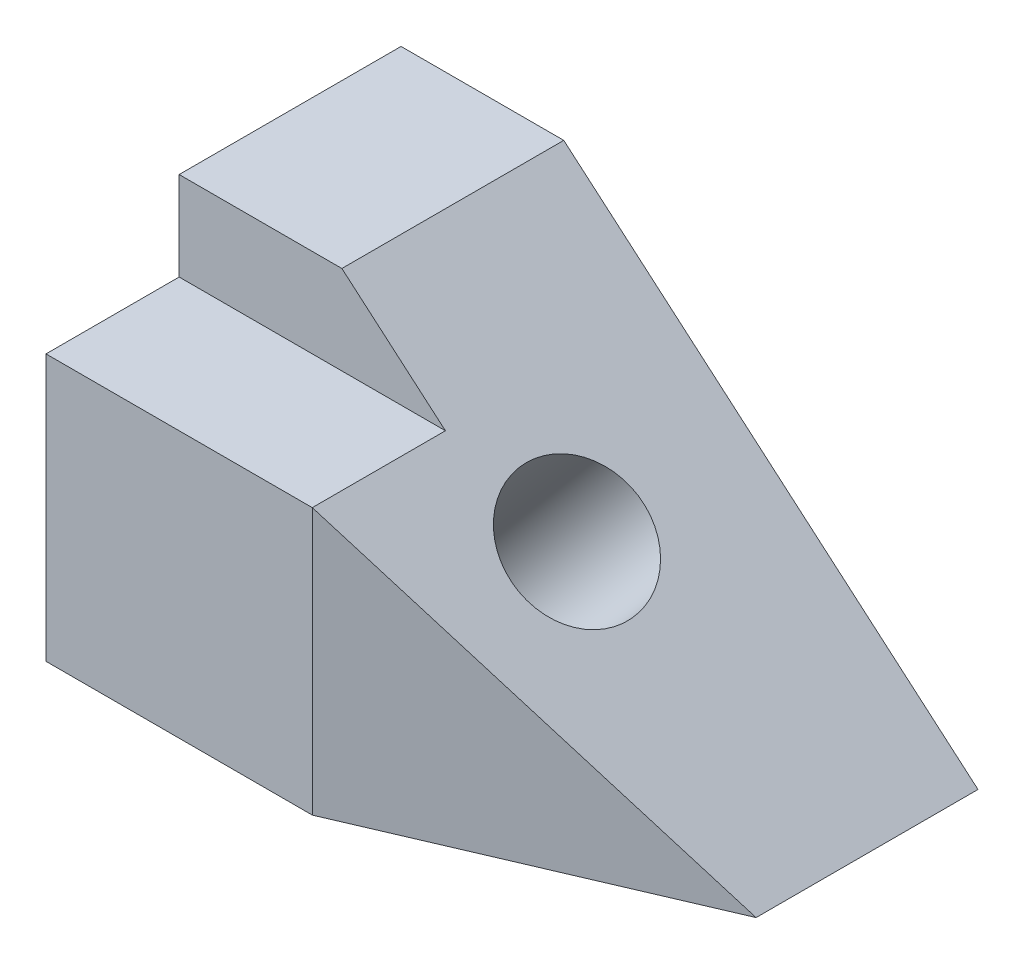
ISO-10303-21;
HEADER;
FILE_DESCRIPTION(('STEP AP214'),'2;1');
FILE_NAME('part.step','',(''),(''),'','','');
FILE_SCHEMA(('AUTOMOTIVE_DESIGN { 1 0 10303 214 1 1 1 1 }'));
ENDSEC;
DATA;
#1=APPLICATION_CONTEXT('core data for automotive mechanical design processes');
#2=APPLICATION_PROTOCOL_DEFINITION('international standard','automotive_design',2000,#1);
#3=PRODUCT_CONTEXT('',#1,'mechanical');
#4=PRODUCT('Part','Part','',(#3));
#5=PRODUCT_RELATED_PRODUCT_CATEGORY('part','',(#4));
#6=PRODUCT_DEFINITION_FORMATION('','',#4);
#7=PRODUCT_DEFINITION_CONTEXT('part definition',#1,'design');
#8=PRODUCT_DEFINITION('design','',#6,#7);
#9=PRODUCT_DEFINITION_SHAPE('','',#8);
#10=(LENGTH_UNIT() NAMED_UNIT(*) SI_UNIT(.MILLI.,.METRE.));
#11=(NAMED_UNIT(*) PLANE_ANGLE_UNIT() SI_UNIT($,.RADIAN.));
#12=(NAMED_UNIT(*) SI_UNIT($,.STERADIAN.) SOLID_ANGLE_UNIT());
#13=UNCERTAINTY_MEASURE_WITH_UNIT(LENGTH_MEASURE(1.E-05),#10,'distance_accuracy_value','');
#14=(GEOMETRIC_REPRESENTATION_CONTEXT(3) GLOBAL_UNCERTAINTY_ASSIGNED_CONTEXT((#13)) GLOBAL_UNIT_ASSIGNED_CONTEXT((#10,
#11,#12)) REPRESENTATION_CONTEXT('',''));
#15=CARTESIAN_POINT('',(0.,0.,0.));
#16=DIRECTION('',(0.,0.,1.));
#17=DIRECTION('',(1.,0.,0.));
#18=AXIS2_PLACEMENT_3D('',#15,#16,#17);
#19=CARTESIAN_POINT('',(40.618487394958,47.3882352941177,-50.));
#20=DIRECTION('',(0.650791373455968,0.759256602365297,0.));
#21=DIRECTION('',(-0.759256602365297,0.650791373455968,0.));
#22=AXIS2_PLACEMENT_3D('',#19,#20,#21);
#23=PLANE('',#22);
#24=CARTESIAN_POINT('',(15.012018931971,69.3366368338208,-10.));
#25=DIRECTION('',(0.650791373455968,0.759256602365297,0.));
#26=DIRECTION('',(-0.759256602365297,0.650791373455968,0.));
#27=AXIS2_PLACEMENT_3D('',#24,#25,#26);
#28=CIRCLE('',#27,15.);
#29=CARTESIAN_POINT('',(3.62316989649152,79.0985074356603,-10.));
#30=VERTEX_POINT('',#29);
#31=EDGE_CURVE('E109',#30,#30,#28,.T.);
#32=ORIENTED_EDGE('',*,*,#31,.F.);
#33=EDGE_LOOP('',(#32));
#34=FACE_BOUND('',#33,.T.);
#35=DIRECTION('',(0.,0.,-1.));
#36=VECTOR('',#35,1.);
#37=CARTESIAN_POINT('',(-4.62857142857143,86.1714285714286,30.));
#38=LINE('',#37,#36);
#39=CARTESIAN_POINT('',(-4.62857142857143,86.1714285714286,30.));
#40=VERTEX_POINT('',#39);
#41=CARTESIAN_POINT('',(-4.62857142857143,86.1714285714286,0.));
#42=VERTEX_POINT('',#41);
#43=EDGE_CURVE('E52',#40,#42,#38,.T.);
#44=ORIENTED_EDGE('',*,*,#43,.F.);
#45=DIRECTION('',(-0.721994872381156,0.618852747755276,0.309426373877638));
#46=VECTOR('',#45,1.);
#47=CARTESIAN_POINT('',(22.1803860182371,63.1923221884499,18.5104468085106));
#48=LINE('',#47,#46);
#49=CARTESIAN_POINT('',(65.3714285714286,26.1714285714286,0.));
#50=VERTEX_POINT('',#49);
#51=EDGE_CURVE('E105',#50,#40,#48,.T.);
#52=ORIENTED_EDGE('',*,*,#51,.F.);
#53=DIRECTION('',(0.,0.,1.));
#54=VECTOR('',#53,1.);
#55=CARTESIAN_POINT('',(65.3714285714286,26.1714285714286,-50.));
#56=LINE('',#55,#54);
#57=CARTESIAN_POINT('',(65.3714285714286,26.1714285714286,-50.));
#58=VERTEX_POINT('',#57);
#59=EDGE_CURVE('E114',#58,#50,#56,.T.);
#60=ORIENTED_EDGE('',*,*,#59,.F.);
#61=DIRECTION('',(-0.759256602365297,0.650791373455968,0.));
#62=VECTOR('',#61,1.);
#63=CARTESIAN_POINT('',(40.618487394958,47.3882352941177,-50.));
#64=LINE('',#63,#62);
#65=CARTESIAN_POINT('',(-27.9619047619048,106.171428571429,-50.));
#66=VERTEX_POINT('',#65);
#67=EDGE_CURVE('E137',#58,#66,#64,.T.);
#68=ORIENTED_EDGE('',*,*,#67,.T.);
#69=DIRECTION('',(0.,0.,1.));
#70=VECTOR('',#69,1.);
#71=CARTESIAN_POINT('',(-27.9619047619048,106.171428571429,-50.));
#72=LINE('',#71,#70);
#73=CARTESIAN_POINT('',(-27.9619047619048,106.171428571429,0.));
#74=VERTEX_POINT('',#73);
#75=EDGE_CURVE('E44',#66,#74,#72,.T.);
#76=ORIENTED_EDGE('',*,*,#75,.T.);
#77=DIRECTION('',(-0.759256602365297,0.650791373455968,0.));
#78=VECTOR('',#77,1.);
#79=CARTESIAN_POINT('',(40.618487394958,47.3882352941177,0.));
#80=LINE('',#79,#78);
#81=EDGE_CURVE('E144',#42,#74,#80,.T.);
#82=ORIENTED_EDGE('',*,*,#81,.F.);
#83=EDGE_LOOP('',(#44,#52,#60,#68,#76,#82));
#84=FACE_BOUND('',#83,.T.);
#85=ADVANCED_FACE('F35',(#34,#84),#23,.T.);
#86=CARTESIAN_POINT('',(0.,26.1714285714286,-50.));
#87=DIRECTION('',(0.,-1.,0.));
#88=DIRECTION('',(0.,0.,-1.));
#89=AXIS2_PLACEMENT_3D('',#86,#87,#88);
#90=PLANE('',#89);
#91=CARTESIAN_POINT('',(-21.9867310072223,26.1714285714286,-10.));
#92=DIRECTION('',(0.,-1.,0.));
#93=DIRECTION('',(1.,0.,0.));
#94=AXIS2_PLACEMENT_3D('',#91,#92,#93);
#95=ELLIPSE('',#94,19.756166694199,15.);
#96=CARTESIAN_POINT('',(-2.23056431302327,26.1714285714286,-10.));
#97=VERTEX_POINT('',#96);
#98=EDGE_CURVE('E156',#97,#97,#95,.F.);
#99=ORIENTED_EDGE('',*,*,#98,.T.);
#100=EDGE_LOOP('',(#99));
#101=FACE_BOUND('',#100,.T.);
#102=ORIENTED_EDGE('',*,*,#59,.T.);
#103=DIRECTION('',(0.919145030018058,0.,-0.393919298579168));
#104=VECTOR('',#103,1.);
#105=CARTESIAN_POINT('',(-4.62857142857145,26.1714285714286,30.));
#106=LINE('',#105,#104);
#107=CARTESIAN_POINT('',(-4.62857142857144,26.1714285714286,30.));
#108=VERTEX_POINT('',#107);
#109=EDGE_CURVE('E103',#108,#50,#106,.T.);
#110=ORIENTED_EDGE('',*,*,#109,.F.);
#111=DIRECTION('',(1.,0.,0.));
#112=VECTOR('',#111,1.);
#113=CARTESIAN_POINT('',(0.,26.1714285714286,30.));
#114=LINE('',#113,#112);
#115=CARTESIAN_POINT('',(-64.6285714285714,26.1714285714286,30.));
#116=VERTEX_POINT('',#115);
#117=EDGE_CURVE('E113',#116,#108,#114,.T.);
#118=ORIENTED_EDGE('',*,*,#117,.F.);
#119=DIRECTION('',(0.,0.,1.));
#120=VECTOR('',#119,1.);
#121=CARTESIAN_POINT('',(-64.6285714285714,26.1714285714286,-50.));
#122=LINE('',#121,#120);
#123=CARTESIAN_POINT('',(-64.6285714285714,26.1714285714286,-50.));
#124=VERTEX_POINT('',#123);
#125=EDGE_CURVE('E39',#124,#116,#122,.T.);
#126=ORIENTED_EDGE('',*,*,#125,.F.);
#127=DIRECTION('',(1.,0.,0.));
#128=VECTOR('',#127,1.);
#129=CARTESIAN_POINT('',(0.,26.1714285714286,-50.));
#130=LINE('',#129,#128);
#131=EDGE_CURVE('E134',#124,#58,#130,.T.);
#132=ORIENTED_EDGE('',*,*,#131,.T.);
#133=EDGE_LOOP('',(#102,#110,#118,#126,#132));
#134=FACE_BOUND('',#133,.T.);
#135=ADVANCED_FACE('F112',(#101,#134),#90,.T.);
#136=CARTESIAN_POINT('',(0.,0.,30.));
#137=DIRECTION('',(0.,0.,1.));
#138=DIRECTION('',(1.,0.,0.));
#139=AXIS2_PLACEMENT_3D('',#136,#137,#138);
#140=PLANE('',#139);
#141=ORIENTED_EDGE('',*,*,#117,.T.);
#142=DIRECTION('',(0.,1.,0.));
#143=VECTOR('',#142,1.);
#144=CARTESIAN_POINT('',(-4.62857142857145,26.1704285714286,30.));
#145=LINE('',#144,#143);
#146=EDGE_CURVE('E100',#108,#40,#145,.T.);
#147=ORIENTED_EDGE('',*,*,#146,.T.);
#148=DIRECTION('',(1.,0.,0.));
#149=VECTOR('',#148,1.);
#150=CARTESIAN_POINT('',(0.,86.1714285714286,30.));
#151=LINE('',#150,#149);
#152=CARTESIAN_POINT('',(-64.6285714285714,86.1714285714286,30.));
#153=VERTEX_POINT('',#152);
#154=EDGE_CURVE('E120',#153,#40,#151,.T.);
#155=ORIENTED_EDGE('',*,*,#154,.F.);
#156=DIRECTION('',(0.,-1.,0.));
#157=VECTOR('',#156,1.);
#158=CARTESIAN_POINT('',(-64.6285714285714,0.,30.));
#159=LINE('',#158,#157);
#160=EDGE_CURVE('E119',#153,#116,#159,.T.);
#161=ORIENTED_EDGE('',*,*,#160,.T.);
#162=EDGE_LOOP('',(#141,#147,#155,#161));
#163=FACE_BOUND('',#162,.T.);
#164=ADVANCED_FACE('F117',(#163),#140,.T.);
#165=CARTESIAN_POINT('',(0.,0.,0.));
#166=DIRECTION('',(0.,0.,1.));
#167=DIRECTION('',(1.,0.,0.));
#168=AXIS2_PLACEMENT_3D('',#165,#166,#167);
#169=PLANE('',#168);
#170=DIRECTION('',(0.,-1.,0.));
#171=VECTOR('',#170,1.);
#172=CARTESIAN_POINT('',(-64.6285714285714,0.,0.));
#173=LINE('',#172,#171);
#174=CARTESIAN_POINT('',(-64.6285714285714,106.171428571429,0.));
#175=VERTEX_POINT('',#174);
#176=CARTESIAN_POINT('',(-64.6285714285714,86.1714285714286,0.));
#177=VERTEX_POINT('',#176);
#178=EDGE_CURVE('E131',#175,#177,#173,.T.);
#179=ORIENTED_EDGE('',*,*,#178,.T.);
#180=DIRECTION('',(1.,0.,0.));
#181=VECTOR('',#180,1.);
#182=CARTESIAN_POINT('',(0.,86.1714285714286,0.));
#183=LINE('',#182,#181);
#184=EDGE_CURVE('E121',#177,#42,#183,.T.);
#185=ORIENTED_EDGE('',*,*,#184,.T.);
#186=ORIENTED_EDGE('',*,*,#81,.T.);
#187=DIRECTION('',(-1.,0.,0.));
#188=VECTOR('',#187,1.);
#189=CARTESIAN_POINT('',(0.,106.171428571429,0.));
#190=LINE('',#189,#188);
#191=EDGE_CURVE('E135',#74,#175,#190,.T.);
#192=ORIENTED_EDGE('',*,*,#191,.T.);
#193=EDGE_LOOP('',(#179,#185,#186,#192));
#194=FACE_BOUND('',#193,.T.);
#195=ADVANCED_FACE('F186',(#194),#169,.T.);
#196=CARTESIAN_POINT('',(-64.6285714285714,0.,-50.));
#197=DIRECTION('',(-1.,0.,0.));
#198=DIRECTION('',(0.,-1.,0.));
#199=AXIS2_PLACEMENT_3D('',#196,#197,#198);
#200=PLANE('',#199);
#201=ORIENTED_EDGE('',*,*,#178,.F.);
#202=DIRECTION('',(0.,0.,1.));
#203=VECTOR('',#202,1.);
#204=CARTESIAN_POINT('',(-64.6285714285714,106.171428571429,-50.));
#205=LINE('',#204,#203);
#206=CARTESIAN_POINT('',(-64.6285714285714,106.171428571429,-50.));
#207=VERTEX_POINT('',#206);
#208=EDGE_CURVE('E11',#207,#175,#205,.T.);
#209=ORIENTED_EDGE('',*,*,#208,.F.);
#210=DIRECTION('',(0.,-1.,0.));
#211=VECTOR('',#210,1.);
#212=CARTESIAN_POINT('',(-64.6285714285714,0.,-50.));
#213=LINE('',#212,#211);
#214=EDGE_CURVE('E132',#207,#124,#213,.T.);
#215=ORIENTED_EDGE('',*,*,#214,.T.);
#216=ORIENTED_EDGE('',*,*,#125,.T.);
#217=ORIENTED_EDGE('',*,*,#160,.F.);
#218=DIRECTION('',(0.,0.,-1.));
#219=VECTOR('',#218,1.);
#220=CARTESIAN_POINT('',(-64.6285714285714,86.1714285714286,30.));
#221=LINE('',#220,#219);
#222=EDGE_CURVE('E127',#153,#177,#221,.T.);
#223=ORIENTED_EDGE('',*,*,#222,.T.);
#224=EDGE_LOOP('',(#201,#209,#215,#216,#217,#223));
#225=FACE_BOUND('',#224,.T.);
#226=ADVANCED_FACE('F37',(#225),#200,.T.);
#227=CARTESIAN_POINT('',(0.,106.171428571429,-50.));
#228=DIRECTION('',(0.,1.,0.));
#229=DIRECTION('',(0.,0.,1.));
#230=AXIS2_PLACEMENT_3D('',#227,#228,#229);
#231=PLANE('',#230);
#232=ORIENTED_EDGE('',*,*,#191,.F.);
#233=ORIENTED_EDGE('',*,*,#75,.F.);
#234=DIRECTION('',(-1.,0.,0.));
#235=VECTOR('',#234,1.);
#236=CARTESIAN_POINT('',(0.,106.171428571429,-50.));
#237=LINE('',#236,#235);
#238=EDGE_CURVE('E140',#66,#207,#237,.T.);
#239=ORIENTED_EDGE('',*,*,#238,.T.);
#240=ORIENTED_EDGE('',*,*,#208,.T.);
#241=EDGE_LOOP('',(#232,#233,#239,#240));
#242=FACE_BOUND('',#241,.T.);
#243=ADVANCED_FACE('F153',(#242),#231,.T.);
#244=CARTESIAN_POINT('',(0.,0.,-50.));
#245=DIRECTION('',(0.,0.,1.));
#246=DIRECTION('',(1.,0.,0.));
#247=AXIS2_PLACEMENT_3D('',#244,#245,#246);
#248=PLANE('',#247);
#249=ORIENTED_EDGE('',*,*,#214,.F.);
#250=ORIENTED_EDGE('',*,*,#238,.F.);
#251=ORIENTED_EDGE('',*,*,#67,.F.);
#252=ORIENTED_EDGE('',*,*,#131,.F.);
#253=EDGE_LOOP('',(#249,#250,#251,#252));
#254=FACE_BOUND('',#253,.T.);
#255=ADVANCED_FACE('F151',(#254),#248,.F.);
#256=CARTESIAN_POINT('',(0.,86.1714285714286,30.));
#257=DIRECTION('',(0.,1.,0.));
#258=DIRECTION('',(-1.,0.,0.));
#259=AXIS2_PLACEMENT_3D('',#256,#257,#258);
#260=PLANE('',#259);
#261=ORIENTED_EDGE('',*,*,#184,.F.);
#262=ORIENTED_EDGE('',*,*,#222,.F.);
#263=ORIENTED_EDGE('',*,*,#154,.T.);
#264=ORIENTED_EDGE('',*,*,#43,.T.);
#265=EDGE_LOOP('',(#261,#262,#263,#264));
#266=FACE_BOUND('',#265,.T.);
#267=ADVANCED_FACE('F165',(#266),#260,.T.);
#268=CARTESIAN_POINT('',(-4.51172227170807,46.5589387628619,-10.));
#269=DIRECTION('',(0.650791373455968,0.759256602365297,0.));
#270=DIRECTION('',(-0.759256602365297,0.650791373455968,0.));
#271=AXIS2_PLACEMENT_3D('',#268,#269,#270);
#272=CYLINDRICAL_SURFACE('',#271,15.);
#273=ORIENTED_EDGE('',*,*,#31,.T.);
#274=EDGE_LOOP('',(#273));
#275=FACE_BOUND('',#274,.T.);
#276=ORIENTED_EDGE('',*,*,#98,.F.);
#277=EDGE_LOOP('',(#276));
#278=FACE_BOUND('',#277,.T.);
#279=ADVANCED_FACE('F163',(#275,#278),#272,.F.);
#280=CARTESIAN_POINT('',(-4.62857142857145,26.1704285714286,30.));
#281=DIRECTION('',(0.393919298579168,0.,0.919145030018058));
#282=DIRECTION('',(0.919145030018058,0.,-0.393919298579168));
#283=AXIS2_PLACEMENT_3D('',#280,#281,#282);
#284=PLANE('',#283);
#285=ORIENTED_EDGE('',*,*,#51,.T.);
#286=ORIENTED_EDGE('',*,*,#146,.F.);
#287=ORIENTED_EDGE('',*,*,#109,.T.);
#288=EDGE_LOOP('',(#285,#286,#287));
#289=FACE_BOUND('',#288,.T.);
#290=ADVANCED_FACE('F102',(#289),#284,.T.);
#291=CLOSED_SHELL('',(#85,#135,#164,#195,#226,#243,#255,#267,#279,#290));
#292=MANIFOLD_SOLID_BREP('B2',#291);
#293=ADVANCED_BREP_SHAPE_REPRESENTATION('',(#18,#292),#14);
#294=SHAPE_DEFINITION_REPRESENTATION(#9,#293);
ENDSEC;
END-ISO-10303-21;
